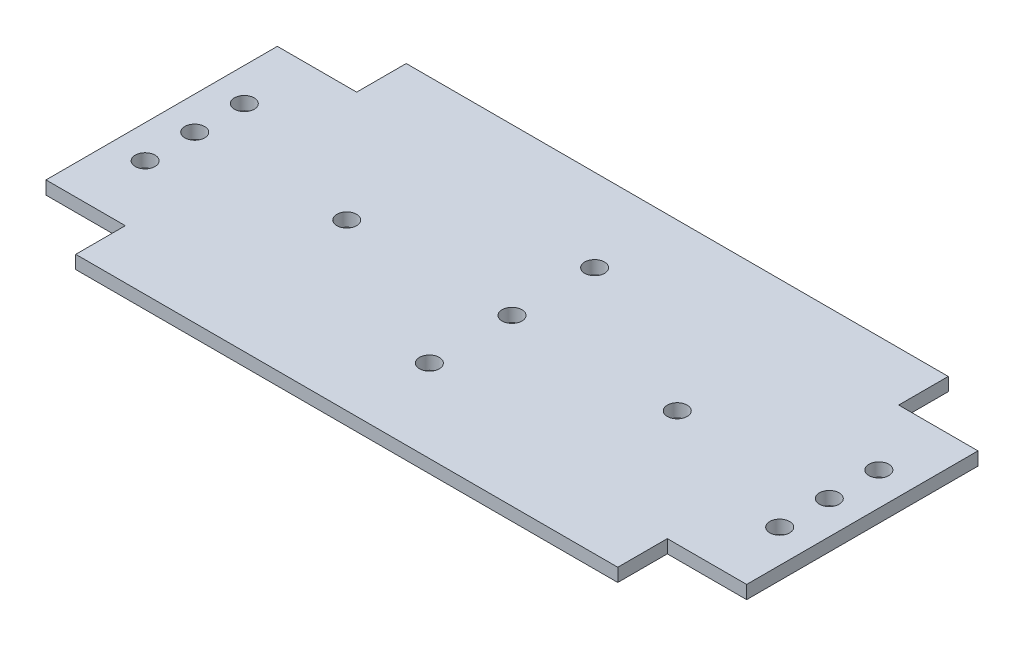
ISO-10303-21;
HEADER;
FILE_DESCRIPTION(('STEP AP214'),'2;1');
FILE_NAME('part.step','',(''),(''),'','','');
FILE_SCHEMA(('AUTOMOTIVE_DESIGN { 1 0 10303 214 1 1 1 1 }'));
ENDSEC;
DATA;
#1=APPLICATION_CONTEXT('core data for automotive mechanical design processes');
#2=APPLICATION_PROTOCOL_DEFINITION('international standard','automotive_design',2000,#1);
#3=PRODUCT_CONTEXT('',#1,'mechanical');
#4=PRODUCT('Part','Part','',(#3));
#5=PRODUCT_RELATED_PRODUCT_CATEGORY('part','',(#4));
#6=PRODUCT_DEFINITION_FORMATION('','',#4);
#7=PRODUCT_DEFINITION_CONTEXT('part definition',#1,'design');
#8=PRODUCT_DEFINITION('design','',#6,#7);
#9=PRODUCT_DEFINITION_SHAPE('','',#8);
#10=(LENGTH_UNIT() NAMED_UNIT(*) SI_UNIT(.MILLI.,.METRE.));
#11=(NAMED_UNIT(*) PLANE_ANGLE_UNIT() SI_UNIT($,.RADIAN.));
#12=(NAMED_UNIT(*) SI_UNIT($,.STERADIAN.) SOLID_ANGLE_UNIT());
#13=UNCERTAINTY_MEASURE_WITH_UNIT(LENGTH_MEASURE(1.E-05),#10,'distance_accuracy_value','');
#14=(GEOMETRIC_REPRESENTATION_CONTEXT(3) GLOBAL_UNCERTAINTY_ASSIGNED_CONTEXT((#13)) GLOBAL_UNIT_ASSIGNED_CONTEXT((#10,
#11,#12)) REPRESENTATION_CONTEXT('',''));
#15=CARTESIAN_POINT('',(0.,0.,0.));
#16=DIRECTION('',(0.,0.,1.));
#17=DIRECTION('',(1.,0.,0.));
#18=AXIS2_PLACEMENT_3D('',#15,#16,#17);
#19=CARTESIAN_POINT('',(82.,4.,35.));
#20=DIRECTION('',(-1.,0.,0.));
#21=DIRECTION('',(0.,0.,1.));
#22=AXIS2_PLACEMENT_3D('',#19,#20,#21);
#23=PLANE('',#22);
#24=DIRECTION('',(0.,0.,-1.));
#25=VECTOR('',#24,1.);
#26=CARTESIAN_POINT('',(82.,0.,35.));
#27=LINE('',#26,#25);
#28=CARTESIAN_POINT('',(82.,0.,50.));
#29=VERTEX_POINT('',#28);
#30=CARTESIAN_POINT('',(82.,0.,35.));
#31=VERTEX_POINT('',#30);
#32=EDGE_CURVE('E175',#29,#31,#27,.T.);
#33=ORIENTED_EDGE('',*,*,#32,.T.);
#34=DIRECTION('',(0.,-1.,0.));
#35=VECTOR('',#34,1.);
#36=CARTESIAN_POINT('',(82.,4.,35.));
#37=LINE('',#36,#35);
#38=CARTESIAN_POINT('',(82.,4.,35.));
#39=VERTEX_POINT('',#38);
#40=EDGE_CURVE('E12',#39,#31,#37,.T.);
#41=ORIENTED_EDGE('',*,*,#40,.F.);
#42=DIRECTION('',(0.,0.,-1.));
#43=VECTOR('',#42,1.);
#44=CARTESIAN_POINT('',(82.,4.,35.));
#45=LINE('',#44,#43);
#46=CARTESIAN_POINT('',(82.,4.,50.));
#47=VERTEX_POINT('',#46);
#48=EDGE_CURVE('E210',#47,#39,#45,.T.);
#49=ORIENTED_EDGE('',*,*,#48,.F.);
#50=DIRECTION('',(0.,-1.,0.));
#51=VECTOR('',#50,1.);
#52=CARTESIAN_POINT('',(82.,4.,50.));
#53=LINE('',#52,#51);
#54=EDGE_CURVE('E171',#47,#29,#53,.T.);
#55=ORIENTED_EDGE('',*,*,#54,.T.);
#56=EDGE_LOOP('',(#33,#41,#49,#55));
#57=FACE_BOUND('',#56,.T.);
#58=ADVANCED_FACE('F50',(#57),#23,.F.);
#59=CARTESIAN_POINT('',(106.,4.,35.));
#60=DIRECTION('',(0.,0.,-1.));
#61=DIRECTION('',(-1.,0.,0.));
#62=AXIS2_PLACEMENT_3D('',#59,#60,#61);
#63=PLANE('',#62);
#64=DIRECTION('',(1.,0.,0.));
#65=VECTOR('',#64,1.);
#66=CARTESIAN_POINT('',(106.,0.,35.));
#67=LINE('',#66,#65);
#68=CARTESIAN_POINT('',(106.,0.,35.));
#69=VERTEX_POINT('',#68);
#70=EDGE_CURVE('E179',#31,#69,#67,.T.);
#71=ORIENTED_EDGE('',*,*,#70,.T.);
#72=DIRECTION('',(0.,-1.,0.));
#73=VECTOR('',#72,1.);
#74=CARTESIAN_POINT('',(106.,4.,35.));
#75=LINE('',#74,#73);
#76=CARTESIAN_POINT('',(106.,4.,35.));
#77=VERTEX_POINT('',#76);
#78=EDGE_CURVE('E59',#77,#69,#75,.T.);
#79=ORIENTED_EDGE('',*,*,#78,.F.);
#80=DIRECTION('',(1.,0.,0.));
#81=VECTOR('',#80,1.);
#82=CARTESIAN_POINT('',(106.,4.,35.));
#83=LINE('',#82,#81);
#84=EDGE_CURVE('E122',#39,#77,#83,.T.);
#85=ORIENTED_EDGE('',*,*,#84,.F.);
#86=ORIENTED_EDGE('',*,*,#40,.T.);
#87=EDGE_LOOP('',(#71,#79,#85,#86));
#88=FACE_BOUND('',#87,.T.);
#89=ADVANCED_FACE('F306',(#88),#63,.F.);
#90=CARTESIAN_POINT('',(106.,4.,35.));
#91=DIRECTION('',(-1.,0.,0.));
#92=DIRECTION('',(0.,0.,1.));
#93=AXIS2_PLACEMENT_3D('',#90,#91,#92);
#94=PLANE('',#93);
#95=DIRECTION('',(0.,0.,-1.));
#96=VECTOR('',#95,1.);
#97=CARTESIAN_POINT('',(106.,0.,35.));
#98=LINE('',#97,#96);
#99=CARTESIAN_POINT('',(106.,0.,-35.));
#100=VERTEX_POINT('',#99);
#101=EDGE_CURVE('E183',#69,#100,#98,.T.);
#102=ORIENTED_EDGE('',*,*,#101,.T.);
#103=DIRECTION('',(0.,-1.,0.));
#104=VECTOR('',#103,1.);
#105=CARTESIAN_POINT('',(106.,4.,-35.));
#106=LINE('',#105,#104);
#107=CARTESIAN_POINT('',(106.,4.,-35.));
#108=VERTEX_POINT('',#107);
#109=EDGE_CURVE('E237',#108,#100,#106,.T.);
#110=ORIENTED_EDGE('',*,*,#109,.F.);
#111=DIRECTION('',(0.,0.,-1.));
#112=VECTOR('',#111,1.);
#113=CARTESIAN_POINT('',(106.,4.,35.));
#114=LINE('',#113,#112);
#115=EDGE_CURVE('E247',#77,#108,#114,.T.);
#116=ORIENTED_EDGE('',*,*,#115,.F.);
#117=ORIENTED_EDGE('',*,*,#78,.T.);
#118=EDGE_LOOP('',(#102,#110,#116,#117));
#119=FACE_BOUND('',#118,.T.);
#120=ADVANCED_FACE('F245',(#119),#94,.F.);
#121=CARTESIAN_POINT('',(106.,4.,-35.));
#122=DIRECTION('',(0.,0.,1.));
#123=DIRECTION('',(1.,0.,0.));
#124=AXIS2_PLACEMENT_3D('',#121,#122,#123);
#125=PLANE('',#124);
#126=DIRECTION('',(-1.,0.,0.));
#127=VECTOR('',#126,1.);
#128=CARTESIAN_POINT('',(106.,0.,-35.));
#129=LINE('',#128,#127);
#130=CARTESIAN_POINT('',(82.,0.,-35.));
#131=VERTEX_POINT('',#130);
#132=EDGE_CURVE('E186',#100,#131,#129,.T.);
#133=ORIENTED_EDGE('',*,*,#132,.T.);
#134=DIRECTION('',(0.,-1.,0.));
#135=VECTOR('',#134,1.);
#136=CARTESIAN_POINT('',(82.,4.,-35.));
#137=LINE('',#136,#135);
#138=CARTESIAN_POINT('',(82.,4.,-35.));
#139=VERTEX_POINT('',#138);
#140=EDGE_CURVE('E233',#139,#131,#137,.T.);
#141=ORIENTED_EDGE('',*,*,#140,.F.);
#142=DIRECTION('',(-1.,0.,0.));
#143=VECTOR('',#142,1.);
#144=CARTESIAN_POINT('',(106.,4.,-35.));
#145=LINE('',#144,#143);
#146=EDGE_CURVE('E266',#108,#139,#145,.T.);
#147=ORIENTED_EDGE('',*,*,#146,.F.);
#148=ORIENTED_EDGE('',*,*,#109,.T.);
#149=EDGE_LOOP('',(#133,#141,#147,#148));
#150=FACE_BOUND('',#149,.T.);
#151=ADVANCED_FACE('F256',(#150),#125,.F.);
#152=CARTESIAN_POINT('',(82.,4.,-50.));
#153=DIRECTION('',(-1.,0.,0.));
#154=DIRECTION('',(0.,0.,1.));
#155=AXIS2_PLACEMENT_3D('',#152,#153,#154);
#156=PLANE('',#155);
#157=DIRECTION('',(0.,0.,-1.));
#158=VECTOR('',#157,1.);
#159=CARTESIAN_POINT('',(82.,0.,-50.));
#160=LINE('',#159,#158);
#161=CARTESIAN_POINT('',(82.,0.,-50.));
#162=VERTEX_POINT('',#161);
#163=EDGE_CURVE('E189',#131,#162,#160,.T.);
#164=ORIENTED_EDGE('',*,*,#163,.T.);
#165=DIRECTION('',(0.,-1.,0.));
#166=VECTOR('',#165,1.);
#167=CARTESIAN_POINT('',(82.,4.,-50.));
#168=LINE('',#167,#166);
#169=CARTESIAN_POINT('',(82.,4.,-50.));
#170=VERTEX_POINT('',#169);
#171=EDGE_CURVE('E229',#170,#162,#168,.T.);
#172=ORIENTED_EDGE('',*,*,#171,.F.);
#173=DIRECTION('',(0.,0.,-1.));
#174=VECTOR('',#173,1.);
#175=CARTESIAN_POINT('',(82.,4.,-50.));
#176=LINE('',#175,#174);
#177=EDGE_CURVE('E262',#139,#170,#176,.T.);
#178=ORIENTED_EDGE('',*,*,#177,.F.);
#179=ORIENTED_EDGE('',*,*,#140,.T.);
#180=EDGE_LOOP('',(#164,#172,#178,#179));
#181=FACE_BOUND('',#180,.T.);
#182=ADVANCED_FACE('F260',(#181),#156,.F.);
#183=CARTESIAN_POINT('',(-82.,4.,-50.));
#184=DIRECTION('',(0.,0.,1.));
#185=DIRECTION('',(1.,0.,0.));
#186=AXIS2_PLACEMENT_3D('',#183,#184,#185);
#187=PLANE('',#186);
#188=DIRECTION('',(-1.,0.,0.));
#189=VECTOR('',#188,1.);
#190=CARTESIAN_POINT('',(-82.,0.,-50.));
#191=LINE('',#190,#189);
#192=CARTESIAN_POINT('',(-82.,0.,-50.));
#193=VERTEX_POINT('',#192);
#194=EDGE_CURVE('E192',#162,#193,#191,.T.);
#195=ORIENTED_EDGE('',*,*,#194,.T.);
#196=DIRECTION('',(0.,-1.,0.));
#197=VECTOR('',#196,1.);
#198=CARTESIAN_POINT('',(-82.,4.,-50.));
#199=LINE('',#198,#197);
#200=CARTESIAN_POINT('',(-82.,4.,-50.));
#201=VERTEX_POINT('',#200);
#202=EDGE_CURVE('E225',#201,#193,#199,.T.);
#203=ORIENTED_EDGE('',*,*,#202,.F.);
#204=DIRECTION('',(-1.,0.,0.));
#205=VECTOR('',#204,1.);
#206=CARTESIAN_POINT('',(-82.,4.,-50.));
#207=LINE('',#206,#205);
#208=EDGE_CURVE('E265',#170,#201,#207,.T.);
#209=ORIENTED_EDGE('',*,*,#208,.F.);
#210=ORIENTED_EDGE('',*,*,#171,.T.);
#211=EDGE_LOOP('',(#195,#203,#209,#210));
#212=FACE_BOUND('',#211,.T.);
#213=ADVANCED_FACE('F319',(#212),#187,.F.);
#214=CARTESIAN_POINT('',(-82.,4.,-50.));
#215=DIRECTION('',(1.,0.,0.));
#216=DIRECTION('',(0.,0.,-1.));
#217=AXIS2_PLACEMENT_3D('',#214,#215,#216);
#218=PLANE('',#217);
#219=DIRECTION('',(0.,0.,1.));
#220=VECTOR('',#219,1.);
#221=CARTESIAN_POINT('',(-82.,0.,-50.));
#222=LINE('',#221,#220);
#223=CARTESIAN_POINT('',(-82.,0.,-35.));
#224=VERTEX_POINT('',#223);
#225=EDGE_CURVE('E195',#193,#224,#222,.T.);
#226=ORIENTED_EDGE('',*,*,#225,.T.);
#227=DIRECTION('',(0.,-1.,0.));
#228=VECTOR('',#227,1.);
#229=CARTESIAN_POINT('',(-82.,4.,-35.));
#230=LINE('',#229,#228);
#231=CARTESIAN_POINT('',(-82.,4.,-35.));
#232=VERTEX_POINT('',#231);
#233=EDGE_CURVE('E221',#232,#224,#230,.T.);
#234=ORIENTED_EDGE('',*,*,#233,.F.);
#235=DIRECTION('',(0.,0.,1.));
#236=VECTOR('',#235,1.);
#237=CARTESIAN_POINT('',(-82.,4.,-50.));
#238=LINE('',#237,#236);
#239=EDGE_CURVE('E270',#201,#232,#238,.T.);
#240=ORIENTED_EDGE('',*,*,#239,.F.);
#241=ORIENTED_EDGE('',*,*,#202,.T.);
#242=EDGE_LOOP('',(#226,#234,#240,#241));
#243=FACE_BOUND('',#242,.T.);
#244=ADVANCED_FACE('F322',(#243),#218,.F.);
#245=CARTESIAN_POINT('',(-106.,4.,-35.));
#246=DIRECTION('',(0.,0.,1.));
#247=DIRECTION('',(1.,0.,0.));
#248=AXIS2_PLACEMENT_3D('',#245,#246,#247);
#249=PLANE('',#248);
#250=DIRECTION('',(-1.,0.,0.));
#251=VECTOR('',#250,1.);
#252=CARTESIAN_POINT('',(-106.,0.,-35.));
#253=LINE('',#252,#251);
#254=CARTESIAN_POINT('',(-106.,0.,-35.));
#255=VERTEX_POINT('',#254);
#256=EDGE_CURVE('E198',#224,#255,#253,.T.);
#257=ORIENTED_EDGE('',*,*,#256,.T.);
#258=DIRECTION('',(0.,-1.,0.));
#259=VECTOR('',#258,1.);
#260=CARTESIAN_POINT('',(-106.,4.,-35.));
#261=LINE('',#260,#259);
#262=CARTESIAN_POINT('',(-106.,4.,-35.));
#263=VERTEX_POINT('',#262);
#264=EDGE_CURVE('E217',#263,#255,#261,.T.);
#265=ORIENTED_EDGE('',*,*,#264,.F.);
#266=DIRECTION('',(-1.,0.,0.));
#267=VECTOR('',#266,1.);
#268=CARTESIAN_POINT('',(-106.,4.,-35.));
#269=LINE('',#268,#267);
#270=EDGE_CURVE('E277',#232,#263,#269,.T.);
#271=ORIENTED_EDGE('',*,*,#270,.F.);
#272=ORIENTED_EDGE('',*,*,#233,.T.);
#273=EDGE_LOOP('',(#257,#265,#271,#272));
#274=FACE_BOUND('',#273,.T.);
#275=ADVANCED_FACE('F285',(#274),#249,.F.);
#276=CARTESIAN_POINT('',(-106.,4.,35.));
#277=DIRECTION('',(1.,0.,0.));
#278=DIRECTION('',(0.,0.,-1.));
#279=AXIS2_PLACEMENT_3D('',#276,#277,#278);
#280=PLANE('',#279);
#281=DIRECTION('',(0.,0.,1.));
#282=VECTOR('',#281,1.);
#283=CARTESIAN_POINT('',(-106.,0.,35.));
#284=LINE('',#283,#282);
#285=CARTESIAN_POINT('',(-106.,0.,35.));
#286=VERTEX_POINT('',#285);
#287=EDGE_CURVE('E201',#255,#286,#284,.T.);
#288=ORIENTED_EDGE('',*,*,#287,.T.);
#289=DIRECTION('',(0.,-1.,0.));
#290=VECTOR('',#289,1.);
#291=CARTESIAN_POINT('',(-106.,4.,35.));
#292=LINE('',#291,#290);
#293=CARTESIAN_POINT('',(-106.,4.,35.));
#294=VERTEX_POINT('',#293);
#295=EDGE_CURVE('E164',#294,#286,#292,.T.);
#296=ORIENTED_EDGE('',*,*,#295,.F.);
#297=DIRECTION('',(0.,0.,1.));
#298=VECTOR('',#297,1.);
#299=CARTESIAN_POINT('',(-106.,4.,35.));
#300=LINE('',#299,#298);
#301=EDGE_CURVE('E153',#263,#294,#300,.T.);
#302=ORIENTED_EDGE('',*,*,#301,.F.);
#303=ORIENTED_EDGE('',*,*,#264,.T.);
#304=EDGE_LOOP('',(#288,#296,#302,#303));
#305=FACE_BOUND('',#304,.T.);
#306=ADVANCED_FACE('F289',(#305),#280,.F.);
#307=CARTESIAN_POINT('',(-106.,4.,35.));
#308=DIRECTION('',(0.,0.,-1.));
#309=DIRECTION('',(-1.,0.,0.));
#310=AXIS2_PLACEMENT_3D('',#307,#308,#309);
#311=PLANE('',#310);
#312=DIRECTION('',(1.,0.,0.));
#313=VECTOR('',#312,1.);
#314=CARTESIAN_POINT('',(-106.,0.,35.));
#315=LINE('',#314,#313);
#316=CARTESIAN_POINT('',(-82.,0.,35.));
#317=VERTEX_POINT('',#316);
#318=EDGE_CURVE('E162',#286,#317,#315,.T.);
#319=ORIENTED_EDGE('',*,*,#318,.T.);
#320=DIRECTION('',(0.,-1.,0.));
#321=VECTOR('',#320,1.);
#322=CARTESIAN_POINT('',(-82.,4.,35.));
#323=LINE('',#322,#321);
#324=CARTESIAN_POINT('',(-82.,4.,35.));
#325=VERTEX_POINT('',#324);
#326=EDGE_CURVE('E159',#325,#317,#323,.T.);
#327=ORIENTED_EDGE('',*,*,#326,.F.);
#328=DIRECTION('',(1.,0.,0.));
#329=VECTOR('',#328,1.);
#330=CARTESIAN_POINT('',(-106.,4.,35.));
#331=LINE('',#330,#329);
#332=EDGE_CURVE('E147',#294,#325,#331,.T.);
#333=ORIENTED_EDGE('',*,*,#332,.F.);
#334=ORIENTED_EDGE('',*,*,#295,.T.);
#335=EDGE_LOOP('',(#319,#327,#333,#334));
#336=FACE_BOUND('',#335,.T.);
#337=ADVANCED_FACE('F160',(#336),#311,.F.);
#338=CARTESIAN_POINT('',(-82.,4.,35.));
#339=DIRECTION('',(1.,0.,0.));
#340=DIRECTION('',(0.,0.,-1.));
#341=AXIS2_PLACEMENT_3D('',#338,#339,#340);
#342=PLANE('',#341);
#343=DIRECTION('',(0.,0.,1.));
#344=VECTOR('',#343,1.);
#345=CARTESIAN_POINT('',(-82.,0.,35.));
#346=LINE('',#345,#344);
#347=CARTESIAN_POINT('',(-82.,0.,50.));
#348=VERTEX_POINT('',#347);
#349=EDGE_CURVE('E108',#317,#348,#346,.T.);
#350=ORIENTED_EDGE('',*,*,#349,.T.);
#351=DIRECTION('',(0.,-1.,0.));
#352=VECTOR('',#351,1.);
#353=CARTESIAN_POINT('',(-82.,4.,50.));
#354=LINE('',#353,#352);
#355=CARTESIAN_POINT('',(-82.,4.,50.));
#356=VERTEX_POINT('',#355);
#357=EDGE_CURVE('E165',#356,#348,#354,.T.);
#358=ORIENTED_EDGE('',*,*,#357,.F.);
#359=DIRECTION('',(0.,0.,1.));
#360=VECTOR('',#359,1.);
#361=CARTESIAN_POINT('',(-82.,4.,35.));
#362=LINE('',#361,#360);
#363=EDGE_CURVE('E151',#325,#356,#362,.T.);
#364=ORIENTED_EDGE('',*,*,#363,.F.);
#365=ORIENTED_EDGE('',*,*,#326,.T.);
#366=EDGE_LOOP('',(#350,#358,#364,#365));
#367=FACE_BOUND('',#366,.T.);
#368=ADVANCED_FACE('F167',(#367),#342,.F.);
#369=CARTESIAN_POINT('',(-82.,4.,50.));
#370=DIRECTION('',(0.,0.,-1.));
#371=DIRECTION('',(-1.,0.,0.));
#372=AXIS2_PLACEMENT_3D('',#369,#370,#371);
#373=PLANE('',#372);
#374=DIRECTION('',(1.,0.,0.));
#375=VECTOR('',#374,1.);
#376=CARTESIAN_POINT('',(-82.,0.,50.));
#377=LINE('',#376,#375);
#378=EDGE_CURVE('E114',#348,#29,#377,.T.);
#379=ORIENTED_EDGE('',*,*,#378,.T.);
#380=ORIENTED_EDGE('',*,*,#54,.F.);
#381=DIRECTION('',(1.,0.,0.));
#382=VECTOR('',#381,1.);
#383=CARTESIAN_POINT('',(-82.,4.,50.));
#384=LINE('',#383,#382);
#385=EDGE_CURVE('E67',#356,#47,#384,.T.);
#386=ORIENTED_EDGE('',*,*,#385,.F.);
#387=ORIENTED_EDGE('',*,*,#357,.T.);
#388=EDGE_LOOP('',(#379,#380,#386,#387));
#389=FACE_BOUND('',#388,.T.);
#390=ADVANCED_FACE('F293',(#389),#373,.F.);
#391=CARTESIAN_POINT('',(0.,4.,0.));
#392=DIRECTION('',(0.,1.,0.));
#393=DIRECTION('',(0.,0.,1.));
#394=AXIS2_PLACEMENT_3D('',#391,#392,#393);
#395=PLANE('',#394);
#396=CARTESIAN_POINT('',(50.,4.,0.));
#397=DIRECTION('',(0.,1.,0.));
#398=DIRECTION('',(0.,0.,1.));
#399=AXIS2_PLACEMENT_3D('',#396,#397,#398);
#400=CIRCLE('',#399,3.);
#401=CARTESIAN_POINT('',(50.,4.,3.));
#402=VERTEX_POINT('',#401);
#403=EDGE_CURVE('E474',#402,#402,#400,.T.);
#404=ORIENTED_EDGE('',*,*,#403,.F.);
#405=EDGE_LOOP('',(#404));
#406=FACE_BOUND('',#405,.T.);
#407=CARTESIAN_POINT('',(0.,4.,0.));
#408=DIRECTION('',(0.,1.,0.));
#409=DIRECTION('',(0.,0.,1.));
#410=AXIS2_PLACEMENT_3D('',#407,#408,#409);
#411=CIRCLE('',#410,3.);
#412=CARTESIAN_POINT('',(0.,4.,3.00000000000001));
#413=VERTEX_POINT('',#412);
#414=EDGE_CURVE('E491',#413,#413,#411,.T.);
#415=ORIENTED_EDGE('',*,*,#414,.F.);
#416=EDGE_LOOP('',(#415));
#417=FACE_BOUND('',#416,.T.);
#418=CARTESIAN_POINT('',(0.,4.,-25.));
#419=DIRECTION('',(0.,1.,0.));
#420=DIRECTION('',(0.,0.,1.));
#421=AXIS2_PLACEMENT_3D('',#418,#419,#420);
#422=CIRCLE('',#421,3.);
#423=CARTESIAN_POINT('',(0.,4.,-22.));
#424=VERTEX_POINT('',#423);
#425=EDGE_CURVE('E490',#424,#424,#422,.T.);
#426=ORIENTED_EDGE('',*,*,#425,.F.);
#427=EDGE_LOOP('',(#426));
#428=FACE_BOUND('',#427,.T.);
#429=CARTESIAN_POINT('',(-50.,4.,0.));
#430=DIRECTION('',(0.,1.,0.));
#431=DIRECTION('',(0.,0.,1.));
#432=AXIS2_PLACEMENT_3D('',#429,#430,#431);
#433=CIRCLE('',#432,3.);
#434=CARTESIAN_POINT('',(-50.,4.,3.00000000000002));
#435=VERTEX_POINT('',#434);
#436=EDGE_CURVE('E505',#435,#435,#433,.T.);
#437=ORIENTED_EDGE('',*,*,#436,.F.);
#438=EDGE_LOOP('',(#437));
#439=FACE_BOUND('',#438,.T.);
#440=CARTESIAN_POINT('',(0.,4.,25.));
#441=DIRECTION('',(0.,1.,0.));
#442=DIRECTION('',(0.,0.,1.));
#443=AXIS2_PLACEMENT_3D('',#440,#441,#442);
#444=CIRCLE('',#443,3.);
#445=CARTESIAN_POINT('',(0.,4.,28.));
#446=VERTEX_POINT('',#445);
#447=EDGE_CURVE('E476',#446,#446,#444,.T.);
#448=ORIENTED_EDGE('',*,*,#447,.F.);
#449=EDGE_LOOP('',(#448));
#450=FACE_BOUND('',#449,.T.);
#451=CARTESIAN_POINT('',(96.,4.,-15.));
#452=DIRECTION('',(0.,1.,0.));
#453=DIRECTION('',(0.,0.,1.));
#454=AXIS2_PLACEMENT_3D('',#451,#452,#453);
#455=CIRCLE('',#454,3.00000000000001);
#456=CARTESIAN_POINT('',(96.,4.,-12.));
#457=VERTEX_POINT('',#456);
#458=EDGE_CURVE('E518',#457,#457,#455,.T.);
#459=ORIENTED_EDGE('',*,*,#458,.F.);
#460=EDGE_LOOP('',(#459));
#461=FACE_BOUND('',#460,.T.);
#462=CARTESIAN_POINT('',(96.,4.,15.));
#463=DIRECTION('',(0.,1.,0.));
#464=DIRECTION('',(0.,0.,1.));
#465=AXIS2_PLACEMENT_3D('',#462,#463,#464);
#466=CIRCLE('',#465,3.00000000000001);
#467=CARTESIAN_POINT('',(96.,4.,18.));
#468=VERTEX_POINT('',#467);
#469=EDGE_CURVE('E522',#468,#468,#466,.T.);
#470=ORIENTED_EDGE('',*,*,#469,.F.);
#471=EDGE_LOOP('',(#470));
#472=FACE_BOUND('',#471,.T.);
#473=CARTESIAN_POINT('',(96.,4.,0.));
#474=DIRECTION('',(0.,1.,0.));
#475=DIRECTION('',(0.,0.,1.));
#476=AXIS2_PLACEMENT_3D('',#473,#474,#475);
#477=CIRCLE('',#476,3.00000000000001);
#478=CARTESIAN_POINT('',(96.,4.,3.00000000000001));
#479=VERTEX_POINT('',#478);
#480=EDGE_CURVE('E530',#479,#479,#477,.T.);
#481=ORIENTED_EDGE('',*,*,#480,.F.);
#482=EDGE_LOOP('',(#481));
#483=FACE_BOUND('',#482,.T.);
#484=CARTESIAN_POINT('',(-96.,4.,-15.));
#485=DIRECTION('',(0.,1.,0.));
#486=DIRECTION('',(0.,0.,1.));
#487=AXIS2_PLACEMENT_3D('',#484,#485,#486);
#488=CIRCLE('',#487,3.00000000000001);
#489=CARTESIAN_POINT('',(-96.,4.,-12.));
#490=VERTEX_POINT('',#489);
#491=EDGE_CURVE('E540',#490,#490,#488,.T.);
#492=ORIENTED_EDGE('',*,*,#491,.F.);
#493=EDGE_LOOP('',(#492));
#494=FACE_BOUND('',#493,.T.);
#495=CARTESIAN_POINT('',(-96.,4.,0.));
#496=DIRECTION('',(0.,1.,0.));
#497=DIRECTION('',(0.,0.,1.));
#498=AXIS2_PLACEMENT_3D('',#495,#496,#497);
#499=CIRCLE('',#498,3.00000000000001);
#500=CARTESIAN_POINT('',(-96.,4.,3.00000000000001));
#501=VERTEX_POINT('',#500);
#502=EDGE_CURVE('E548',#501,#501,#499,.T.);
#503=ORIENTED_EDGE('',*,*,#502,.F.);
#504=EDGE_LOOP('',(#503));
#505=FACE_BOUND('',#504,.T.);
#506=CARTESIAN_POINT('',(-96.,4.,15.));
#507=DIRECTION('',(0.,1.,0.));
#508=DIRECTION('',(0.,0.,1.));
#509=AXIS2_PLACEMENT_3D('',#506,#507,#508);
#510=CIRCLE('',#509,3.00000000000001);
#511=CARTESIAN_POINT('',(-96.,4.,18.));
#512=VERTEX_POINT('',#511);
#513=EDGE_CURVE('E517',#512,#512,#510,.T.);
#514=ORIENTED_EDGE('',*,*,#513,.F.);
#515=EDGE_LOOP('',(#514));
#516=FACE_BOUND('',#515,.T.);
#517=ORIENTED_EDGE('',*,*,#48,.T.);
#518=ORIENTED_EDGE('',*,*,#84,.T.);
#519=ORIENTED_EDGE('',*,*,#115,.T.);
#520=ORIENTED_EDGE('',*,*,#146,.T.);
#521=ORIENTED_EDGE('',*,*,#177,.T.);
#522=ORIENTED_EDGE('',*,*,#208,.T.);
#523=ORIENTED_EDGE('',*,*,#239,.T.);
#524=ORIENTED_EDGE('',*,*,#270,.T.);
#525=ORIENTED_EDGE('',*,*,#301,.T.);
#526=ORIENTED_EDGE('',*,*,#332,.T.);
#527=ORIENTED_EDGE('',*,*,#363,.T.);
#528=ORIENTED_EDGE('',*,*,#385,.T.);
#529=EDGE_LOOP('',(#517,#518,#519,#520,#521,#522,#523,#524,#525,#526,#527,#528));
#530=FACE_BOUND('',#529,.T.);
#531=ADVANCED_FACE('F149',(#406,#417,#428,#439,#450,#461,#472,#483,#494,#505,#516,#530),#395,.T.);
#532=CARTESIAN_POINT('',(0.,0.,0.));
#533=DIRECTION('',(0.,1.,0.));
#534=DIRECTION('',(0.,0.,1.));
#535=AXIS2_PLACEMENT_3D('',#532,#533,#534);
#536=PLANE('',#535);
#537=CARTESIAN_POINT('',(50.,0.,0.));
#538=DIRECTION('',(0.,1.,0.));
#539=DIRECTION('',(0.,0.,1.));
#540=AXIS2_PLACEMENT_3D('',#537,#538,#539);
#541=CIRCLE('',#540,3.);
#542=CARTESIAN_POINT('',(50.,0.,3.));
#543=VERTEX_POINT('',#542);
#544=EDGE_CURVE('E471',#543,#543,#541,.F.);
#545=ORIENTED_EDGE('',*,*,#544,.F.);
#546=EDGE_LOOP('',(#545));
#547=FACE_BOUND('',#546,.T.);
#548=CARTESIAN_POINT('',(0.,0.,0.));
#549=DIRECTION('',(0.,1.,0.));
#550=DIRECTION('',(0.,0.,1.));
#551=AXIS2_PLACEMENT_3D('',#548,#549,#550);
#552=CIRCLE('',#551,3.);
#553=CARTESIAN_POINT('',(0.,0.,3.00000000000001));
#554=VERTEX_POINT('',#553);
#555=EDGE_CURVE('E496',#554,#554,#552,.F.);
#556=ORIENTED_EDGE('',*,*,#555,.F.);
#557=EDGE_LOOP('',(#556));
#558=FACE_BOUND('',#557,.T.);
#559=CARTESIAN_POINT('',(0.,0.,-25.));
#560=DIRECTION('',(0.,1.,0.));
#561=DIRECTION('',(0.,0.,1.));
#562=AXIS2_PLACEMENT_3D('',#559,#560,#561);
#563=CIRCLE('',#562,3.);
#564=CARTESIAN_POINT('',(0.,0.,-22.));
#565=VERTEX_POINT('',#564);
#566=EDGE_CURVE('E486',#565,#565,#563,.F.);
#567=ORIENTED_EDGE('',*,*,#566,.F.);
#568=EDGE_LOOP('',(#567));
#569=FACE_BOUND('',#568,.T.);
#570=CARTESIAN_POINT('',(-50.,0.,0.));
#571=DIRECTION('',(0.,1.,0.));
#572=DIRECTION('',(0.,0.,1.));
#573=AXIS2_PLACEMENT_3D('',#570,#571,#572);
#574=CIRCLE('',#573,3.);
#575=CARTESIAN_POINT('',(-50.,0.,3.00000000000002));
#576=VERTEX_POINT('',#575);
#577=EDGE_CURVE('E495',#576,#576,#574,.F.);
#578=ORIENTED_EDGE('',*,*,#577,.F.);
#579=EDGE_LOOP('',(#578));
#580=FACE_BOUND('',#579,.T.);
#581=CARTESIAN_POINT('',(0.,0.,25.));
#582=DIRECTION('',(0.,1.,0.));
#583=DIRECTION('',(0.,0.,1.));
#584=AXIS2_PLACEMENT_3D('',#581,#582,#583);
#585=CIRCLE('',#584,3.);
#586=CARTESIAN_POINT('',(0.,0.,28.));
#587=VERTEX_POINT('',#586);
#588=EDGE_CURVE('E483',#587,#587,#585,.F.);
#589=ORIENTED_EDGE('',*,*,#588,.F.);
#590=EDGE_LOOP('',(#589));
#591=FACE_BOUND('',#590,.T.);
#592=CARTESIAN_POINT('',(96.,0.,-15.));
#593=DIRECTION('',(0.,1.,0.));
#594=DIRECTION('',(0.,0.,1.));
#595=AXIS2_PLACEMENT_3D('',#592,#593,#594);
#596=CIRCLE('',#595,3.00000000000001);
#597=CARTESIAN_POINT('',(96.,0.,-12.));
#598=VERTEX_POINT('',#597);
#599=EDGE_CURVE('E513',#598,#598,#596,.T.);
#600=ORIENTED_EDGE('',*,*,#599,.T.);
#601=EDGE_LOOP('',(#600));
#602=FACE_BOUND('',#601,.T.);
#603=CARTESIAN_POINT('',(96.,0.,15.));
#604=DIRECTION('',(0.,1.,0.));
#605=DIRECTION('',(0.,0.,1.));
#606=AXIS2_PLACEMENT_3D('',#603,#604,#605);
#607=CIRCLE('',#606,3.00000000000001);
#608=CARTESIAN_POINT('',(96.,0.,18.));
#609=VERTEX_POINT('',#608);
#610=EDGE_CURVE('E526',#609,#609,#607,.T.);
#611=ORIENTED_EDGE('',*,*,#610,.T.);
#612=EDGE_LOOP('',(#611));
#613=FACE_BOUND('',#612,.T.);
#614=CARTESIAN_POINT('',(96.,0.,0.));
#615=DIRECTION('',(0.,1.,0.));
#616=DIRECTION('',(0.,0.,1.));
#617=AXIS2_PLACEMENT_3D('',#614,#615,#616);
#618=CIRCLE('',#617,3.00000000000001);
#619=CARTESIAN_POINT('',(96.,0.,3.00000000000001));
#620=VERTEX_POINT('',#619);
#621=EDGE_CURVE('E480',#620,#620,#618,.T.);
#622=ORIENTED_EDGE('',*,*,#621,.T.);
#623=EDGE_LOOP('',(#622));
#624=FACE_BOUND('',#623,.T.);
#625=CARTESIAN_POINT('',(-96.,0.,-15.));
#626=DIRECTION('',(0.,1.,0.));
#627=DIRECTION('',(0.,0.,1.));
#628=AXIS2_PLACEMENT_3D('',#625,#626,#627);
#629=CIRCLE('',#628,3.00000000000001);
#630=CARTESIAN_POINT('',(-96.,0.,-12.));
#631=VERTEX_POINT('',#630);
#632=EDGE_CURVE('E180',#631,#631,#629,.T.);
#633=ORIENTED_EDGE('',*,*,#632,.T.);
#634=EDGE_LOOP('',(#633));
#635=FACE_BOUND('',#634,.T.);
#636=CARTESIAN_POINT('',(-96.,0.,0.));
#637=DIRECTION('',(0.,1.,0.));
#638=DIRECTION('',(0.,0.,1.));
#639=AXIS2_PLACEMENT_3D('',#636,#637,#638);
#640=CIRCLE('',#639,3.00000000000001);
#641=CARTESIAN_POINT('',(-96.,0.,3.00000000000001));
#642=VERTEX_POINT('',#641);
#643=EDGE_CURVE('E544',#642,#642,#640,.T.);
#644=ORIENTED_EDGE('',*,*,#643,.T.);
#645=EDGE_LOOP('',(#644));
#646=FACE_BOUND('',#645,.T.);
#647=CARTESIAN_POINT('',(-96.,0.,15.));
#648=DIRECTION('',(0.,1.,0.));
#649=DIRECTION('',(0.,0.,1.));
#650=AXIS2_PLACEMENT_3D('',#647,#648,#649);
#651=CIRCLE('',#650,3.00000000000001);
#652=CARTESIAN_POINT('',(-96.,0.,18.));
#653=VERTEX_POINT('',#652);
#654=EDGE_CURVE('E552',#653,#653,#651,.T.);
#655=ORIENTED_EDGE('',*,*,#654,.T.);
#656=EDGE_LOOP('',(#655));
#657=FACE_BOUND('',#656,.T.);
#658=ORIENTED_EDGE('',*,*,#32,.F.);
#659=ORIENTED_EDGE('',*,*,#378,.F.);
#660=ORIENTED_EDGE('',*,*,#349,.F.);
#661=ORIENTED_EDGE('',*,*,#318,.F.);
#662=ORIENTED_EDGE('',*,*,#287,.F.);
#663=ORIENTED_EDGE('',*,*,#256,.F.);
#664=ORIENTED_EDGE('',*,*,#225,.F.);
#665=ORIENTED_EDGE('',*,*,#194,.F.);
#666=ORIENTED_EDGE('',*,*,#163,.F.);
#667=ORIENTED_EDGE('',*,*,#132,.F.);
#668=ORIENTED_EDGE('',*,*,#101,.F.);
#669=ORIENTED_EDGE('',*,*,#70,.F.);
#670=EDGE_LOOP('',(#658,#659,#660,#661,#662,#663,#664,#665,#666,#667,#668,#669));
#671=FACE_BOUND('',#670,.T.);
#672=ADVANCED_FACE('F251',(#547,#558,#569,#580,#591,#602,#613,#624,#635,#646,#657,#671),#536,.F.);
#673=CARTESIAN_POINT('',(-96.,0.,15.));
#674=DIRECTION('',(0.,1.,0.));
#675=DIRECTION('',(0.,0.,1.));
#676=AXIS2_PLACEMENT_3D('',#673,#674,#675);
#677=CYLINDRICAL_SURFACE('',#676,3.00000000000001);
#678=ORIENTED_EDGE('',*,*,#654,.F.);
#679=EDGE_LOOP('',(#678));
#680=FACE_BOUND('',#679,.T.);
#681=ORIENTED_EDGE('',*,*,#513,.T.);
#682=EDGE_LOOP('',(#681));
#683=FACE_BOUND('',#682,.T.);
#684=ADVANCED_FACE('F350',(#680,#683),#677,.F.);
#685=CARTESIAN_POINT('',(-96.,0.,0.));
#686=DIRECTION('',(0.,1.,0.));
#687=DIRECTION('',(0.,0.,1.));
#688=AXIS2_PLACEMENT_3D('',#685,#686,#687);
#689=CYLINDRICAL_SURFACE('',#688,3.00000000000001);
#690=ORIENTED_EDGE('',*,*,#643,.F.);
#691=EDGE_LOOP('',(#690));
#692=FACE_BOUND('',#691,.T.);
#693=ORIENTED_EDGE('',*,*,#502,.T.);
#694=EDGE_LOOP('',(#693));
#695=FACE_BOUND('',#694,.T.);
#696=ADVANCED_FACE('F355',(#692,#695),#689,.F.);
#697=CARTESIAN_POINT('',(-96.,0.,-15.));
#698=DIRECTION('',(0.,1.,0.));
#699=DIRECTION('',(0.,0.,1.));
#700=AXIS2_PLACEMENT_3D('',#697,#698,#699);
#701=CYLINDRICAL_SURFACE('',#700,3.00000000000001);
#702=ORIENTED_EDGE('',*,*,#632,.F.);
#703=EDGE_LOOP('',(#702));
#704=FACE_BOUND('',#703,.T.);
#705=ORIENTED_EDGE('',*,*,#491,.T.);
#706=EDGE_LOOP('',(#705));
#707=FACE_BOUND('',#706,.T.);
#708=ADVANCED_FACE('F367',(#704,#707),#701,.F.);
#709=CARTESIAN_POINT('',(96.,0.,0.));
#710=DIRECTION('',(0.,1.,0.));
#711=DIRECTION('',(0.,0.,1.));
#712=AXIS2_PLACEMENT_3D('',#709,#710,#711);
#713=CYLINDRICAL_SURFACE('',#712,3.00000000000001);
#714=ORIENTED_EDGE('',*,*,#621,.F.);
#715=EDGE_LOOP('',(#714));
#716=FACE_BOUND('',#715,.T.);
#717=ORIENTED_EDGE('',*,*,#480,.T.);
#718=EDGE_LOOP('',(#717));
#719=FACE_BOUND('',#718,.T.);
#720=ADVANCED_FACE('F377',(#716,#719),#713,.F.);
#721=CARTESIAN_POINT('',(96.,0.,15.));
#722=DIRECTION('',(0.,1.,0.));
#723=DIRECTION('',(0.,0.,1.));
#724=AXIS2_PLACEMENT_3D('',#721,#722,#723);
#725=CYLINDRICAL_SURFACE('',#724,3.00000000000001);
#726=ORIENTED_EDGE('',*,*,#610,.F.);
#727=EDGE_LOOP('',(#726));
#728=FACE_BOUND('',#727,.T.);
#729=ORIENTED_EDGE('',*,*,#469,.T.);
#730=EDGE_LOOP('',(#729));
#731=FACE_BOUND('',#730,.T.);
#732=ADVANCED_FACE('F387',(#728,#731),#725,.F.);
#733=CARTESIAN_POINT('',(96.,0.,-15.));
#734=DIRECTION('',(0.,1.,0.));
#735=DIRECTION('',(0.,0.,1.));
#736=AXIS2_PLACEMENT_3D('',#733,#734,#735);
#737=CYLINDRICAL_SURFACE('',#736,3.00000000000001);
#738=ORIENTED_EDGE('',*,*,#599,.F.);
#739=EDGE_LOOP('',(#738));
#740=FACE_BOUND('',#739,.T.);
#741=ORIENTED_EDGE('',*,*,#458,.T.);
#742=EDGE_LOOP('',(#741));
#743=FACE_BOUND('',#742,.T.);
#744=ADVANCED_FACE('F397',(#740,#743),#737,.F.);
#745=CARTESIAN_POINT('',(0.,-8.48528137423857,25.));
#746=DIRECTION('',(0.,1.,0.));
#747=DIRECTION('',(0.,0.,1.));
#748=AXIS2_PLACEMENT_3D('',#745,#746,#747);
#749=CYLINDRICAL_SURFACE('',#748,3.);
#750=ORIENTED_EDGE('',*,*,#588,.T.);
#751=EDGE_LOOP('',(#750));
#752=FACE_BOUND('',#751,.T.);
#753=ORIENTED_EDGE('',*,*,#447,.T.);
#754=EDGE_LOOP('',(#753));
#755=FACE_BOUND('',#754,.T.);
#756=ADVANCED_FACE('F406',(#752,#755),#749,.F.);
#757=CARTESIAN_POINT('',(-50.,-8.48528137423857,0.));
#758=DIRECTION('',(0.,1.,0.));
#759=DIRECTION('',(0.,0.,1.));
#760=AXIS2_PLACEMENT_3D('',#757,#758,#759);
#761=CYLINDRICAL_SURFACE('',#760,3.);
#762=ORIENTED_EDGE('',*,*,#577,.T.);
#763=EDGE_LOOP('',(#762));
#764=FACE_BOUND('',#763,.T.);
#765=ORIENTED_EDGE('',*,*,#436,.T.);
#766=EDGE_LOOP('',(#765));
#767=FACE_BOUND('',#766,.T.);
#768=ADVANCED_FACE('F423',(#764,#767),#761,.F.);
#769=CARTESIAN_POINT('',(0.,-8.48528137423857,-25.));
#770=DIRECTION('',(0.,1.,0.));
#771=DIRECTION('',(0.,0.,1.));
#772=AXIS2_PLACEMENT_3D('',#769,#770,#771);
#773=CYLINDRICAL_SURFACE('',#772,3.);
#774=ORIENTED_EDGE('',*,*,#566,.T.);
#775=EDGE_LOOP('',(#774));
#776=FACE_BOUND('',#775,.T.);
#777=ORIENTED_EDGE('',*,*,#425,.T.);
#778=EDGE_LOOP('',(#777));
#779=FACE_BOUND('',#778,.T.);
#780=ADVANCED_FACE('F433',(#776,#779),#773,.F.);
#781=CARTESIAN_POINT('',(0.,-8.48528137423857,0.));
#782=DIRECTION('',(0.,1.,0.));
#783=DIRECTION('',(0.,0.,1.));
#784=AXIS2_PLACEMENT_3D('',#781,#782,#783);
#785=CYLINDRICAL_SURFACE('',#784,3.);
#786=ORIENTED_EDGE('',*,*,#414,.T.);
#787=EDGE_LOOP('',(#786));
#788=FACE_BOUND('',#787,.T.);
#789=ORIENTED_EDGE('',*,*,#555,.T.);
#790=EDGE_LOOP('',(#789));
#791=FACE_BOUND('',#790,.T.);
#792=ADVANCED_FACE('F443',(#788,#791),#785,.F.);
#793=CARTESIAN_POINT('',(50.,-8.48528137423857,0.));
#794=DIRECTION('',(0.,1.,0.));
#795=DIRECTION('',(0.,0.,1.));
#796=AXIS2_PLACEMENT_3D('',#793,#794,#795);
#797=CYLINDRICAL_SURFACE('',#796,3.);
#798=ORIENTED_EDGE('',*,*,#544,.T.);
#799=EDGE_LOOP('',(#798));
#800=FACE_BOUND('',#799,.T.);
#801=ORIENTED_EDGE('',*,*,#403,.T.);
#802=EDGE_LOOP('',(#801));
#803=FACE_BOUND('',#802,.T.);
#804=ADVANCED_FACE('F454',(#800,#803),#797,.F.);
#805=CLOSED_SHELL('',(#58,#89,#120,#151,#182,#213,#244,#275,#306,#337,#368,#390,#531,#672,#684,
#696,#708,#720,#732,#744,#756,#768,#780,#792,#804));
#806=MANIFOLD_SOLID_BREP('B2',#805);
#807=ADVANCED_BREP_SHAPE_REPRESENTATION('',(#18,#806),#14);
#808=SHAPE_DEFINITION_REPRESENTATION(#9,#807);
ENDSEC;
END-ISO-10303-21;
